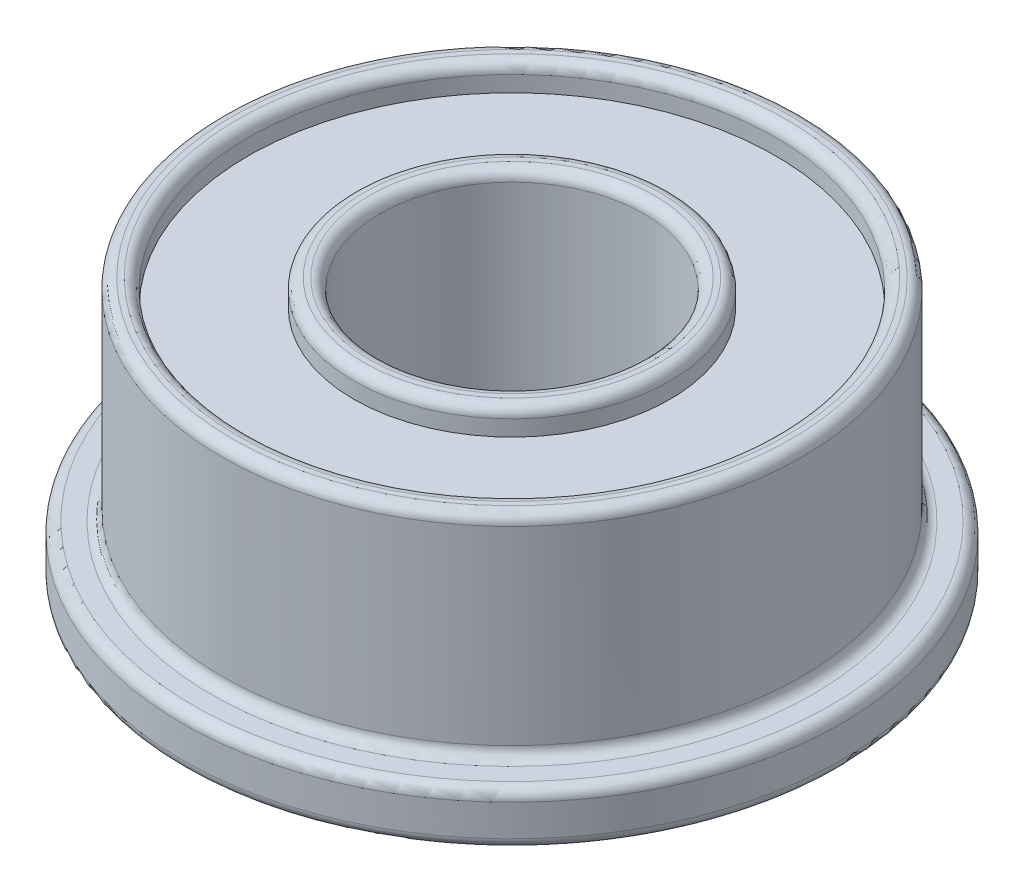
ISO-10303-21;
HEADER;
FILE_DESCRIPTION(('STEP AP214'),'2;1');
FILE_NAME('part.step','',(''),(''),'','','');
FILE_SCHEMA(('AUTOMOTIVE_DESIGN { 1 0 10303 214 1 1 1 1 }'));
ENDSEC;
DATA;
#1=APPLICATION_CONTEXT('core data for automotive mechanical design processes');
#2=APPLICATION_PROTOCOL_DEFINITION('international standard','automotive_design',2000,#1);
#3=PRODUCT_CONTEXT('',#1,'mechanical');
#4=PRODUCT('Part','Part','',(#3));
#5=PRODUCT_RELATED_PRODUCT_CATEGORY('part','',(#4));
#6=PRODUCT_DEFINITION_FORMATION('','',#4);
#7=PRODUCT_DEFINITION_CONTEXT('part definition',#1,'design');
#8=PRODUCT_DEFINITION('design','',#6,#7);
#9=PRODUCT_DEFINITION_SHAPE('','',#8);
#10=(LENGTH_UNIT() NAMED_UNIT(*) SI_UNIT(.MILLI.,.METRE.));
#11=(NAMED_UNIT(*) PLANE_ANGLE_UNIT() SI_UNIT($,.RADIAN.));
#12=(NAMED_UNIT(*) SI_UNIT($,.STERADIAN.) SOLID_ANGLE_UNIT());
#13=UNCERTAINTY_MEASURE_WITH_UNIT(LENGTH_MEASURE(1.E-05),#10,'distance_accuracy_value','');
#14=(GEOMETRIC_REPRESENTATION_CONTEXT(3) GLOBAL_UNCERTAINTY_ASSIGNED_CONTEXT((#13)) GLOBAL_UNIT_ASSIGNED_CONTEXT((#10,
#11,#12)) REPRESENTATION_CONTEXT('',''));
#15=CARTESIAN_POINT('',(0.,0.,0.));
#16=DIRECTION('',(0.,0.,1.));
#17=DIRECTION('',(1.,0.,0.));
#18=AXIS2_PLACEMENT_3D('',#15,#16,#17);
#19=CARTESIAN_POINT('',(0.,-2.5,0.));
#20=DIRECTION('',(0.,1.,0.));
#21=DIRECTION('',(0.,0.,1.));
#22=AXIS2_PLACEMENT_3D('',#19,#20,#21);
#23=PLANE('',#22);
#24=CARTESIAN_POINT('',(0.,-2.5,0.));
#25=DIRECTION('',(0.,1.,0.));
#26=DIRECTION('',(0.,0.,1.));
#27=AXIS2_PLACEMENT_3D('',#24,#25,#26);
#28=CIRCLE('',#27,2.8);
#29=CARTESIAN_POINT('',(0.,-2.5,2.8));
#30=VERTEX_POINT('',#29);
#31=EDGE_CURVE('E89',#30,#30,#28,.F.);
#32=ORIENTED_EDGE('',*,*,#31,.T.);
#33=EDGE_LOOP('',(#32));
#34=FACE_BOUND('',#33,.T.);
#35=CARTESIAN_POINT('',(0.,-2.5,0.));
#36=DIRECTION('',(0.,1.,0.));
#37=DIRECTION('',(0.,0.,1.));
#38=AXIS2_PLACEMENT_3D('',#35,#36,#37);
#39=CIRCLE('',#38,2.7);
#40=CARTESIAN_POINT('',(0.,-2.5,2.7));
#41=VERTEX_POINT('',#40);
#42=EDGE_CURVE('E92',#41,#41,#39,.T.);
#43=ORIENTED_EDGE('',*,*,#42,.T.);
#44=EDGE_LOOP('',(#43));
#45=FACE_BOUND('',#44,.T.);
#46=ADVANCED_FACE('F36',(#34,#45),#23,.F.);
#47=CARTESIAN_POINT('',(0.,2.5,0.));
#48=DIRECTION('',(0.,1.,0.));
#49=DIRECTION('',(0.,0.,1.));
#50=AXIS2_PLACEMENT_3D('',#47,#48,#49);
#51=PLANE('',#50);
#52=CARTESIAN_POINT('',(0.,2.5,0.));
#53=DIRECTION('',(0.,1.,0.));
#54=DIRECTION('',(0.,0.,1.));
#55=AXIS2_PLACEMENT_3D('',#52,#53,#54);
#56=CIRCLE('',#55,2.8);
#57=CARTESIAN_POINT('',(0.,2.5,2.8));
#58=VERTEX_POINT('',#57);
#59=EDGE_CURVE('E71',#58,#58,#56,.T.);
#60=ORIENTED_EDGE('',*,*,#59,.T.);
#61=EDGE_LOOP('',(#60));
#62=FACE_BOUND('',#61,.T.);
#63=CARTESIAN_POINT('',(0.,2.5,0.));
#64=DIRECTION('',(0.,1.,0.));
#65=DIRECTION('',(0.,0.,1.));
#66=AXIS2_PLACEMENT_3D('',#63,#64,#65);
#67=CIRCLE('',#66,2.7);
#68=CARTESIAN_POINT('',(0.,2.5,2.7));
#69=VERTEX_POINT('',#68);
#70=EDGE_CURVE('E74',#69,#69,#67,.F.);
#71=ORIENTED_EDGE('',*,*,#70,.T.);
#72=EDGE_LOOP('',(#71));
#73=FACE_BOUND('',#72,.T.);
#74=ADVANCED_FACE('F136',(#62,#73),#51,.T.);
#75=CARTESIAN_POINT('',(0.,2.5,0.));
#76=DIRECTION('',(0.,-1.,0.));
#77=DIRECTION('',(0.,0.,-1.));
#78=AXIS2_PLACEMENT_3D('',#75,#76,#77);
#79=CYLINDRICAL_SURFACE('',#78,5.5);
#80=CARTESIAN_POINT('',(0.,-1.3,0.));
#81=DIRECTION('',(0.,-1.,0.));
#82=DIRECTION('',(0.,0.,-1.));
#83=AXIS2_PLACEMENT_3D('',#80,#81,#82);
#84=CIRCLE('',#83,5.5);
#85=CARTESIAN_POINT('',(0.,-1.3,-5.5));
#86=VERTEX_POINT('',#85);
#87=EDGE_CURVE('E47',#86,#86,#84,.F.);
#88=ORIENTED_EDGE('',*,*,#87,.T.);
#89=EDGE_LOOP('',(#88));
#90=FACE_BOUND('',#89,.T.);
#91=CARTESIAN_POINT('',(0.,2.3,0.));
#92=DIRECTION('',(0.,1.,0.));
#93=DIRECTION('',(0.,0.,1.));
#94=AXIS2_PLACEMENT_3D('',#91,#92,#93);
#95=CIRCLE('',#94,5.5);
#96=CARTESIAN_POINT('',(0.,2.3,5.5));
#97=VERTEX_POINT('',#96);
#98=EDGE_CURVE('E51',#97,#97,#95,.F.);
#99=ORIENTED_EDGE('',*,*,#98,.T.);
#100=EDGE_LOOP('',(#99));
#101=FACE_BOUND('',#100,.T.);
#102=ADVANCED_FACE('F143',(#90,#101),#79,.T.);
#103=CARTESIAN_POINT('',(0.,2.5,0.));
#104=DIRECTION('',(0.,1.,0.));
#105=DIRECTION('',(0.,0.,1.));
#106=AXIS2_PLACEMENT_3D('',#103,#104,#105);
#107=CIRCLE('',#106,5.2);
#108=CARTESIAN_POINT('',(0.,2.5,5.2));
#109=VERTEX_POINT('',#108);
#110=EDGE_CURVE('E77',#109,#109,#107,.F.);
#111=ORIENTED_EDGE('',*,*,#110,.T.);
#112=EDGE_LOOP('',(#111));
#113=FACE_BOUND('',#112,.T.);
#114=CARTESIAN_POINT('',(0.,2.5,0.));
#115=DIRECTION('',(0.,1.,0.));
#116=DIRECTION('',(0.,0.,1.));
#117=AXIS2_PLACEMENT_3D('',#114,#115,#116);
#118=CIRCLE('',#117,5.3);
#119=CARTESIAN_POINT('',(0.,2.5,5.3));
#120=VERTEX_POINT('',#119);
#121=EDGE_CURVE('E80',#120,#120,#118,.T.);
#122=ORIENTED_EDGE('',*,*,#121,.T.);
#123=EDGE_LOOP('',(#122));
#124=FACE_BOUND('',#123,.T.);
#125=ADVANCED_FACE('F146',(#113,#124),#51,.T.);
#126=CARTESIAN_POINT('',(0.,-2.5,0.));
#127=DIRECTION('',(0.,1.,0.));
#128=DIRECTION('',(0.,0.,1.));
#129=AXIS2_PLACEMENT_3D('',#126,#127,#128);
#130=CIRCLE('',#129,5.2);
#131=CARTESIAN_POINT('',(0.,-2.5,5.2));
#132=VERTEX_POINT('',#131);
#133=EDGE_CURVE('E95',#132,#132,#130,.T.);
#134=ORIENTED_EDGE('',*,*,#133,.T.);
#135=EDGE_LOOP('',(#134));
#136=FACE_BOUND('',#135,.T.);
#137=CARTESIAN_POINT('',(0.,-2.5,0.));
#138=DIRECTION('',(0.,1.,0.));
#139=DIRECTION('',(0.,0.,1.));
#140=AXIS2_PLACEMENT_3D('',#137,#138,#139);
#141=CIRCLE('',#140,6.05);
#142=CARTESIAN_POINT('',(0.,-2.5,6.05));
#143=VERTEX_POINT('',#142);
#144=EDGE_CURVE('E98',#143,#143,#141,.F.);
#145=ORIENTED_EDGE('',*,*,#144,.T.);
#146=EDGE_LOOP('',(#145));
#147=FACE_BOUND('',#146,.T.);
#148=ADVANCED_FACE('F139',(#136,#147),#23,.F.);
#149=CARTESIAN_POINT('',(0.,2.5,0.));
#150=DIRECTION('',(0.,-1.,0.));
#151=DIRECTION('',(0.,0.,-1.));
#152=AXIS2_PLACEMENT_3D('',#149,#150,#151);
#153=CYLINDRICAL_SURFACE('',#152,2.5);
#154=CARTESIAN_POINT('',(0.,-2.3,0.));
#155=DIRECTION('',(0.,1.,0.));
#156=DIRECTION('',(0.,0.,1.));
#157=AXIS2_PLACEMENT_3D('',#154,#155,#156);
#158=CIRCLE('',#157,2.5);
#159=CARTESIAN_POINT('',(0.,-2.3,2.5));
#160=VERTEX_POINT('',#159);
#161=EDGE_CURVE('E59',#160,#160,#158,.F.);
#162=ORIENTED_EDGE('',*,*,#161,.T.);
#163=EDGE_LOOP('',(#162));
#164=FACE_BOUND('',#163,.T.);
#165=CARTESIAN_POINT('',(0.,2.3,0.));
#166=DIRECTION('',(0.,1.,0.));
#167=DIRECTION('',(0.,0.,1.));
#168=AXIS2_PLACEMENT_3D('',#165,#166,#167);
#169=CIRCLE('',#168,2.5);
#170=CARTESIAN_POINT('',(0.,2.3,2.5));
#171=VERTEX_POINT('',#170);
#172=EDGE_CURVE('E62',#171,#171,#169,.T.);
#173=ORIENTED_EDGE('',*,*,#172,.T.);
#174=EDGE_LOOP('',(#173));
#175=FACE_BOUND('',#174,.T.);
#176=ADVANCED_FACE('F150',(#164,#175),#153,.F.);
#177=CARTESIAN_POINT('',(0.,-1.5,0.));
#178=DIRECTION('',(0.,-1.,0.));
#179=DIRECTION('',(0.,0.,-1.));
#180=AXIS2_PLACEMENT_3D('',#177,#178,#179);
#181=CYLINDRICAL_SURFACE('',#180,6.25);
#182=CARTESIAN_POINT('',(0.,-1.7,0.));
#183=DIRECTION('',(0.,-1.,0.));
#184=DIRECTION('',(0.,0.,-1.));
#185=AXIS2_PLACEMENT_3D('',#182,#183,#184);
#186=CIRCLE('',#185,6.25);
#187=CARTESIAN_POINT('',(0.,-1.7,-6.25));
#188=VERTEX_POINT('',#187);
#189=EDGE_CURVE('E43',#188,#188,#186,.T.);
#190=ORIENTED_EDGE('',*,*,#189,.T.);
#191=EDGE_LOOP('',(#190));
#192=FACE_BOUND('',#191,.T.);
#193=CARTESIAN_POINT('',(0.,-2.3,0.));
#194=DIRECTION('',(0.,1.,0.));
#195=DIRECTION('',(0.,0.,1.));
#196=AXIS2_PLACEMENT_3D('',#193,#194,#195);
#197=CIRCLE('',#196,6.25);
#198=CARTESIAN_POINT('',(0.,-2.3,6.25));
#199=VERTEX_POINT('',#198);
#200=EDGE_CURVE('E65',#199,#199,#197,.T.);
#201=ORIENTED_EDGE('',*,*,#200,.T.);
#202=EDGE_LOOP('',(#201));
#203=FACE_BOUND('',#202,.T.);
#204=ADVANCED_FACE('F156',(#192,#203),#181,.T.);
#205=CARTESIAN_POINT('',(0.,-1.5,0.));
#206=DIRECTION('',(0.,-1.,0.));
#207=DIRECTION('',(0.,0.,-1.));
#208=AXIS2_PLACEMENT_3D('',#205,#206,#207);
#209=PLANE('',#208);
#210=CARTESIAN_POINT('',(0.,-1.5,0.));
#211=DIRECTION('',(0.,-1.,0.));
#212=DIRECTION('',(0.,0.,-1.));
#213=AXIS2_PLACEMENT_3D('',#210,#211,#212);
#214=CIRCLE('',#213,6.05);
#215=CARTESIAN_POINT('',(0.,-1.5,-6.05));
#216=VERTEX_POINT('',#215);
#217=EDGE_CURVE('E11',#216,#216,#214,.F.);
#218=ORIENTED_EDGE('',*,*,#217,.T.);
#219=EDGE_LOOP('',(#218));
#220=FACE_BOUND('',#219,.T.);
#221=CARTESIAN_POINT('',(0.,-1.5,0.));
#222=DIRECTION('',(0.,-1.,0.));
#223=DIRECTION('',(0.,0.,-1.));
#224=AXIS2_PLACEMENT_3D('',#221,#222,#223);
#225=CIRCLE('',#224,5.7);
#226=CARTESIAN_POINT('',(0.,-1.5,-5.7));
#227=VERTEX_POINT('',#226);
#228=EDGE_CURVE('E56',#227,#227,#225,.T.);
#229=ORIENTED_EDGE('',*,*,#228,.T.);
#230=EDGE_LOOP('',(#229));
#231=FACE_BOUND('',#230,.T.);
#232=ADVANCED_FACE('F230',(#220,#231),#209,.F.);
#233=CARTESIAN_POINT('',(0.,2.,0.));
#234=DIRECTION('',(0.,1.,0.));
#235=DIRECTION('',(0.,0.,1.));
#236=AXIS2_PLACEMENT_3D('',#233,#234,#235);
#237=CYLINDRICAL_SURFACE('',#236,3.);
#238=CARTESIAN_POINT('',(0.,2.3,0.));
#239=DIRECTION('',(0.,1.,0.));
#240=DIRECTION('',(0.,0.,1.));
#241=AXIS2_PLACEMENT_3D('',#238,#239,#240);
#242=CIRCLE('',#241,3.);
#243=CARTESIAN_POINT('',(0.,2.3,3.));
#244=VERTEX_POINT('',#243);
#245=EDGE_CURVE('E68',#244,#244,#242,.F.);
#246=ORIENTED_EDGE('',*,*,#245,.T.);
#247=EDGE_LOOP('',(#246));
#248=FACE_BOUND('',#247,.T.);
#249=CARTESIAN_POINT('',(0.,2.,0.));
#250=DIRECTION('',(0.,1.,0.));
#251=DIRECTION('',(0.,0.,1.));
#252=AXIS2_PLACEMENT_3D('',#249,#250,#251);
#253=CIRCLE('',#252,3.);
#254=CARTESIAN_POINT('',(0.,2.,3.));
#255=VERTEX_POINT('',#254);
#256=EDGE_CURVE('E107',#255,#255,#253,.T.);
#257=ORIENTED_EDGE('',*,*,#256,.T.);
#258=EDGE_LOOP('',(#257));
#259=FACE_BOUND('',#258,.T.);
#260=ADVANCED_FACE('F223',(#248,#259),#237,.T.);
#261=CARTESIAN_POINT('',(0.,2.,0.));
#262=DIRECTION('',(0.,1.,0.));
#263=DIRECTION('',(0.,0.,1.));
#264=AXIS2_PLACEMENT_3D('',#261,#262,#263);
#265=CYLINDRICAL_SURFACE('',#264,5.);
#266=CARTESIAN_POINT('',(0.,2.3,0.));
#267=DIRECTION('',(0.,1.,0.));
#268=DIRECTION('',(0.,0.,1.));
#269=AXIS2_PLACEMENT_3D('',#266,#267,#268);
#270=CIRCLE('',#269,5.);
#271=CARTESIAN_POINT('',(0.,2.3,5.));
#272=VERTEX_POINT('',#271);
#273=EDGE_CURVE('E83',#272,#272,#270,.T.);
#274=ORIENTED_EDGE('',*,*,#273,.T.);
#275=EDGE_LOOP('',(#274));
#276=FACE_BOUND('',#275,.T.);
#277=CARTESIAN_POINT('',(0.,2.,0.));
#278=DIRECTION('',(0.,1.,0.));
#279=DIRECTION('',(0.,0.,1.));
#280=AXIS2_PLACEMENT_3D('',#277,#278,#279);
#281=CIRCLE('',#280,5.);
#282=CARTESIAN_POINT('',(0.,2.,5.));
#283=VERTEX_POINT('',#282);
#284=EDGE_CURVE('E104',#283,#283,#281,.T.);
#285=ORIENTED_EDGE('',*,*,#284,.F.);
#286=EDGE_LOOP('',(#285));
#287=FACE_BOUND('',#286,.T.);
#288=ADVANCED_FACE('F132',(#276,#287),#265,.F.);
#289=CARTESIAN_POINT('',(0.,2.,0.));
#290=DIRECTION('',(0.,1.,0.));
#291=DIRECTION('',(0.,0.,1.));
#292=AXIS2_PLACEMENT_3D('',#289,#290,#291);
#293=PLANE('',#292);
#294=ORIENTED_EDGE('',*,*,#256,.F.);
#295=EDGE_LOOP('',(#294));
#296=FACE_BOUND('',#295,.T.);
#297=ORIENTED_EDGE('',*,*,#284,.T.);
#298=EDGE_LOOP('',(#297));
#299=FACE_BOUND('',#298,.T.);
#300=ADVANCED_FACE('F123',(#296,#299),#293,.T.);
#301=CARTESIAN_POINT('',(0.,-2.,0.));
#302=DIRECTION('',(0.,-1.,0.));
#303=DIRECTION('',(0.,0.,-1.));
#304=AXIS2_PLACEMENT_3D('',#301,#302,#303);
#305=CYLINDRICAL_SURFACE('',#304,3.);
#306=CARTESIAN_POINT('',(0.,-2.3,0.));
#307=DIRECTION('',(0.,1.,0.));
#308=DIRECTION('',(0.,0.,1.));
#309=AXIS2_PLACEMENT_3D('',#306,#307,#308);
#310=CIRCLE('',#309,3.);
#311=CARTESIAN_POINT('',(0.,-2.3,3.));
#312=VERTEX_POINT('',#311);
#313=EDGE_CURVE('E86',#312,#312,#310,.T.);
#314=ORIENTED_EDGE('',*,*,#313,.T.);
#315=EDGE_LOOP('',(#314));
#316=FACE_BOUND('',#315,.T.);
#317=CARTESIAN_POINT('',(0.,-2.,0.));
#318=DIRECTION('',(0.,1.,0.));
#319=DIRECTION('',(0.,0.,1.));
#320=AXIS2_PLACEMENT_3D('',#317,#318,#319);
#321=CIRCLE('',#320,3.);
#322=CARTESIAN_POINT('',(0.,-2.,3.));
#323=VERTEX_POINT('',#322);
#324=EDGE_CURVE('E113',#323,#323,#321,.T.);
#325=ORIENTED_EDGE('',*,*,#324,.F.);
#326=EDGE_LOOP('',(#325));
#327=FACE_BOUND('',#326,.T.);
#328=ADVANCED_FACE('F120',(#316,#327),#305,.T.);
#329=CARTESIAN_POINT('',(0.,-2.,0.));
#330=DIRECTION('',(0.,-1.,0.));
#331=DIRECTION('',(0.,0.,-1.));
#332=AXIS2_PLACEMENT_3D('',#329,#330,#331);
#333=CYLINDRICAL_SURFACE('',#332,5.);
#334=CARTESIAN_POINT('',(0.,-2.3,0.));
#335=DIRECTION('',(0.,1.,0.));
#336=DIRECTION('',(0.,0.,1.));
#337=AXIS2_PLACEMENT_3D('',#334,#335,#336);
#338=CIRCLE('',#337,5.);
#339=CARTESIAN_POINT('',(0.,-2.3,5.));
#340=VERTEX_POINT('',#339);
#341=EDGE_CURVE('E101',#340,#340,#338,.F.);
#342=ORIENTED_EDGE('',*,*,#341,.T.);
#343=EDGE_LOOP('',(#342));
#344=FACE_BOUND('',#343,.T.);
#345=CARTESIAN_POINT('',(0.,-2.,0.));
#346=DIRECTION('',(0.,1.,0.));
#347=DIRECTION('',(0.,0.,1.));
#348=AXIS2_PLACEMENT_3D('',#345,#346,#347);
#349=CIRCLE('',#348,5.);
#350=CARTESIAN_POINT('',(0.,-2.,5.));
#351=VERTEX_POINT('',#350);
#352=EDGE_CURVE('E110',#351,#351,#349,.T.);
#353=ORIENTED_EDGE('',*,*,#352,.T.);
#354=EDGE_LOOP('',(#353));
#355=FACE_BOUND('',#354,.T.);
#356=ADVANCED_FACE('F122',(#344,#355),#333,.F.);
#357=CARTESIAN_POINT('',(0.,-2.,0.));
#358=DIRECTION('',(0.,-1.,0.));
#359=DIRECTION('',(0.,0.,1.));
#360=AXIS2_PLACEMENT_3D('',#357,#358,#359);
#361=PLANE('',#360);
#362=ORIENTED_EDGE('',*,*,#324,.T.);
#363=EDGE_LOOP('',(#362));
#364=FACE_BOUND('',#363,.T.);
#365=ORIENTED_EDGE('',*,*,#352,.F.);
#366=EDGE_LOOP('',(#365));
#367=FACE_BOUND('',#366,.T.);
#368=ADVANCED_FACE('F117',(#364,#367),#361,.T.);
#369=CARTESIAN_POINT('',(0.,-2.3,0.));
#370=DIRECTION('',(0.,1.,0.));
#371=DIRECTION('',(0.,0.,1.));
#372=AXIS2_PLACEMENT_3D('',#369,#370,#371);
#373=TOROIDAL_SURFACE('',#372,5.2,0.2);
#374=ORIENTED_EDGE('',*,*,#133,.F.);
#375=EDGE_LOOP('',(#374));
#376=FACE_BOUND('',#375,.T.);
#377=ORIENTED_EDGE('',*,*,#341,.F.);
#378=EDGE_LOOP('',(#377));
#379=FACE_BOUND('',#378,.T.);
#380=ADVANCED_FACE('F206',(#376,#379),#373,.T.);
#381=CARTESIAN_POINT('',(0.,-2.3,0.));
#382=DIRECTION('',(0.,1.,0.));
#383=DIRECTION('',(0.,0.,1.));
#384=AXIS2_PLACEMENT_3D('',#381,#382,#383);
#385=TOROIDAL_SURFACE('',#384,2.8,0.2);
#386=ORIENTED_EDGE('',*,*,#313,.F.);
#387=EDGE_LOOP('',(#386));
#388=FACE_BOUND('',#387,.T.);
#389=ORIENTED_EDGE('',*,*,#31,.F.);
#390=EDGE_LOOP('',(#389));
#391=FACE_BOUND('',#390,.T.);
#392=ADVANCED_FACE('F209',(#388,#391),#385,.T.);
#393=CARTESIAN_POINT('',(0.,2.3,0.));
#394=DIRECTION('',(0.,1.,0.));
#395=DIRECTION('',(0.,0.,1.));
#396=AXIS2_PLACEMENT_3D('',#393,#394,#395);
#397=TOROIDAL_SURFACE('',#396,5.2,0.2);
#398=ORIENTED_EDGE('',*,*,#110,.F.);
#399=EDGE_LOOP('',(#398));
#400=FACE_BOUND('',#399,.T.);
#401=ORIENTED_EDGE('',*,*,#273,.F.);
#402=EDGE_LOOP('',(#401));
#403=FACE_BOUND('',#402,.T.);
#404=ADVANCED_FACE('F177',(#400,#403),#397,.T.);
#405=CARTESIAN_POINT('',(0.,2.3,0.));
#406=DIRECTION('',(0.,1.,0.));
#407=DIRECTION('',(0.,0.,1.));
#408=AXIS2_PLACEMENT_3D('',#405,#406,#407);
#409=TOROIDAL_SURFACE('',#408,2.8,0.2);
#410=ORIENTED_EDGE('',*,*,#245,.F.);
#411=EDGE_LOOP('',(#410));
#412=FACE_BOUND('',#411,.T.);
#413=ORIENTED_EDGE('',*,*,#59,.F.);
#414=EDGE_LOOP('',(#413));
#415=FACE_BOUND('',#414,.T.);
#416=ADVANCED_FACE('F167',(#412,#415),#409,.T.);
#417=CARTESIAN_POINT('',(0.,-2.3,0.));
#418=DIRECTION('',(0.,1.,0.));
#419=DIRECTION('',(0.,0.,1.));
#420=AXIS2_PLACEMENT_3D('',#417,#418,#419);
#421=TOROIDAL_SURFACE('',#420,6.05,0.2);
#422=ORIENTED_EDGE('',*,*,#200,.F.);
#423=EDGE_LOOP('',(#422));
#424=FACE_BOUND('',#423,.T.);
#425=ORIENTED_EDGE('',*,*,#144,.F.);
#426=EDGE_LOOP('',(#425));
#427=FACE_BOUND('',#426,.T.);
#428=ADVANCED_FACE('F164',(#424,#427),#421,.T.);
#429=CARTESIAN_POINT('',(0.,-2.3,0.));
#430=DIRECTION('',(0.,1.,0.));
#431=DIRECTION('',(0.,0.,1.));
#432=AXIS2_PLACEMENT_3D('',#429,#430,#431);
#433=TOROIDAL_SURFACE('',#432,2.7,0.2);
#434=ORIENTED_EDGE('',*,*,#161,.F.);
#435=EDGE_LOOP('',(#434));
#436=FACE_BOUND('',#435,.T.);
#437=ORIENTED_EDGE('',*,*,#42,.F.);
#438=EDGE_LOOP('',(#437));
#439=FACE_BOUND('',#438,.T.);
#440=ADVANCED_FACE('F166',(#436,#439),#433,.T.);
#441=CARTESIAN_POINT('',(0.,2.3,0.));
#442=DIRECTION('',(0.,1.,0.));
#443=DIRECTION('',(0.,0.,1.));
#444=AXIS2_PLACEMENT_3D('',#441,#442,#443);
#445=TOROIDAL_SURFACE('',#444,2.7,0.2);
#446=ORIENTED_EDGE('',*,*,#70,.F.);
#447=EDGE_LOOP('',(#446));
#448=FACE_BOUND('',#447,.T.);
#449=ORIENTED_EDGE('',*,*,#172,.F.);
#450=EDGE_LOOP('',(#449));
#451=FACE_BOUND('',#450,.T.);
#452=ADVANCED_FACE('F174',(#448,#451),#445,.T.);
#453=CARTESIAN_POINT('',(0.,-1.3,0.));
#454=DIRECTION('',(0.,-1.,0.));
#455=DIRECTION('',(0.,0.,-1.));
#456=AXIS2_PLACEMENT_3D('',#453,#454,#455);
#457=TOROIDAL_SURFACE('',#456,5.7,0.2);
#458=ORIENTED_EDGE('',*,*,#87,.F.);
#459=EDGE_LOOP('',(#458));
#460=FACE_BOUND('',#459,.T.);
#461=ORIENTED_EDGE('',*,*,#228,.F.);
#462=EDGE_LOOP('',(#461));
#463=FACE_BOUND('',#462,.T.);
#464=ADVANCED_FACE('F185',(#460,#463),#457,.F.);
#465=CARTESIAN_POINT('',(0.,2.3,0.));
#466=DIRECTION('',(0.,1.,0.));
#467=DIRECTION('',(0.,0.,1.));
#468=AXIS2_PLACEMENT_3D('',#465,#466,#467);
#469=TOROIDAL_SURFACE('',#468,5.3,0.2);
#470=ORIENTED_EDGE('',*,*,#98,.F.);
#471=EDGE_LOOP('',(#470));
#472=FACE_BOUND('',#471,.T.);
#473=ORIENTED_EDGE('',*,*,#121,.F.);
#474=EDGE_LOOP('',(#473));
#475=FACE_BOUND('',#474,.T.);
#476=ADVANCED_FACE('F188',(#472,#475),#469,.T.);
#477=CARTESIAN_POINT('',(0.,-1.7,0.));
#478=DIRECTION('',(0.,-1.,0.));
#479=DIRECTION('',(0.,0.,-1.));
#480=AXIS2_PLACEMENT_3D('',#477,#478,#479);
#481=TOROIDAL_SURFACE('',#480,6.05,0.2);
#482=ORIENTED_EDGE('',*,*,#217,.F.);
#483=EDGE_LOOP('',(#482));
#484=FACE_BOUND('',#483,.T.);
#485=ORIENTED_EDGE('',*,*,#189,.F.);
#486=EDGE_LOOP('',(#485));
#487=FACE_BOUND('',#486,.T.);
#488=ADVANCED_FACE('F38',(#484,#487),#481,.T.);
#489=CLOSED_SHELL('',(#46,#74,#102,#125,#148,#176,#204,#232,#260,#288,#300,#328,#356,#368,#380,
#392,#404,#416,#428,#440,#452,#464,#476,#488));
#490=MANIFOLD_SOLID_BREP('B2',#489);
#491=ADVANCED_BREP_SHAPE_REPRESENTATION('',(#18,#490),#14);
#492=SHAPE_DEFINITION_REPRESENTATION(#9,#491);
ENDSEC;
END-ISO-10303-21;
